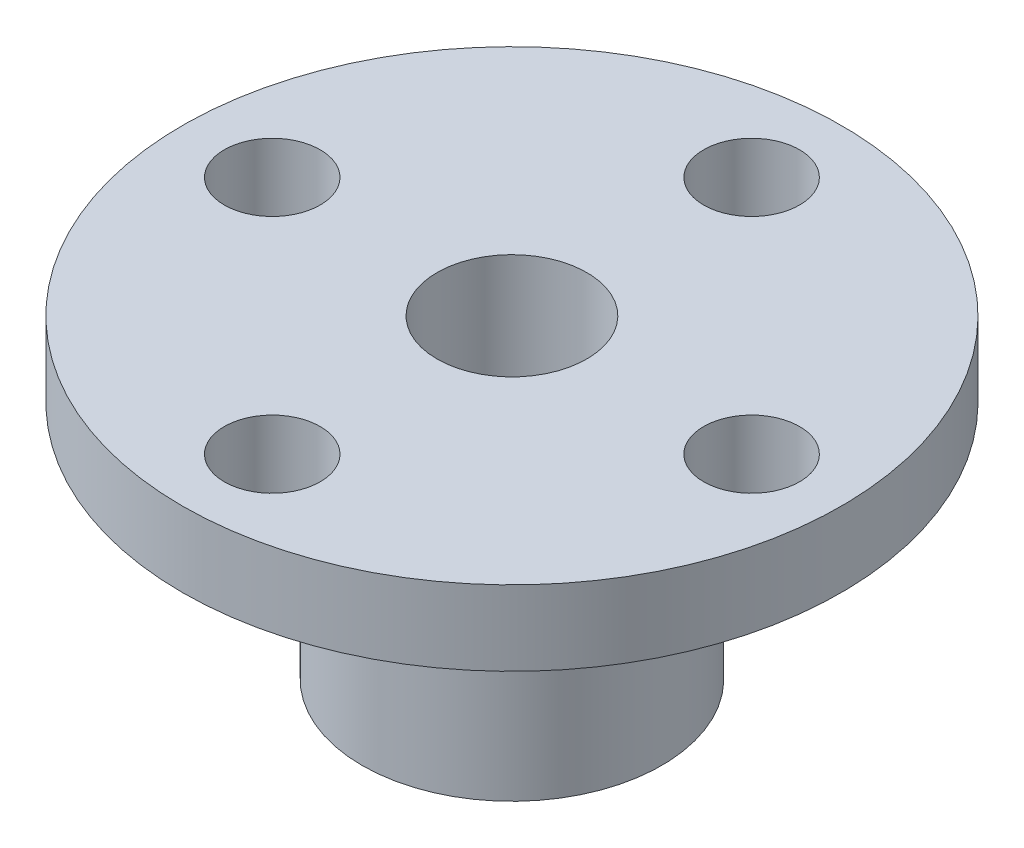
ISO-10303-21;
HEADER;
FILE_DESCRIPTION(('STEP AP214'),'2;1');
FILE_NAME('part.step','',(''),(''),'','','');
FILE_SCHEMA(('AUTOMOTIVE_DESIGN { 1 0 10303 214 1 1 1 1 }'));
ENDSEC;
DATA;
#1=APPLICATION_CONTEXT('core data for automotive mechanical design processes');
#2=APPLICATION_PROTOCOL_DEFINITION('international standard','automotive_design',2000,#1);
#3=PRODUCT_CONTEXT('',#1,'mechanical');
#4=PRODUCT('Part','Part','',(#3));
#5=PRODUCT_RELATED_PRODUCT_CATEGORY('part','',(#4));
#6=PRODUCT_DEFINITION_FORMATION('','',#4);
#7=PRODUCT_DEFINITION_CONTEXT('part definition',#1,'design');
#8=PRODUCT_DEFINITION('design','',#6,#7);
#9=PRODUCT_DEFINITION_SHAPE('','',#8);
#10=(LENGTH_UNIT() NAMED_UNIT(*) SI_UNIT(.MILLI.,.METRE.));
#11=(NAMED_UNIT(*) PLANE_ANGLE_UNIT() SI_UNIT($,.RADIAN.));
#12=(NAMED_UNIT(*) SI_UNIT($,.STERADIAN.) SOLID_ANGLE_UNIT());
#13=UNCERTAINTY_MEASURE_WITH_UNIT(LENGTH_MEASURE(1.E-05),#10,'distance_accuracy_value','');
#14=(GEOMETRIC_REPRESENTATION_CONTEXT(3) GLOBAL_UNCERTAINTY_ASSIGNED_CONTEXT((#13)) GLOBAL_UNIT_ASSIGNED_CONTEXT((#10,
#11,#12)) REPRESENTATION_CONTEXT('',''));
#15=CARTESIAN_POINT('',(0.,0.,0.));
#16=DIRECTION('',(0.,0.,1.));
#17=DIRECTION('',(1.,0.,0.));
#18=AXIS2_PLACEMENT_3D('',#15,#16,#17);
#19=CARTESIAN_POINT('',(0.,0.,0.));
#20=DIRECTION('',(0.,1.,0.));
#21=DIRECTION('',(0.,0.,1.));
#22=AXIS2_PLACEMENT_3D('',#19,#20,#21);
#23=PLANE('',#22);
#24=CARTESIAN_POINT('',(0.,0.,0.));
#25=DIRECTION('',(0.,1.,0.));
#26=DIRECTION('',(0.,0.,1.));
#27=AXIS2_PLACEMENT_3D('',#24,#25,#26);
#28=CIRCLE('',#27,5.);
#29=CARTESIAN_POINT('',(0.,0.,5.));
#30=VERTEX_POINT('',#29);
#31=EDGE_CURVE('E38',#30,#30,#28,.T.);
#32=ORIENTED_EDGE('',*,*,#31,.F.);
#33=EDGE_LOOP('',(#32));
#34=FACE_BOUND('',#33,.T.);
#35=CARTESIAN_POINT('',(0.,0.,0.));
#36=DIRECTION('',(0.,1.,0.));
#37=DIRECTION('',(0.,0.,1.));
#38=AXIS2_PLACEMENT_3D('',#35,#36,#37);
#39=CIRCLE('',#38,2.5);
#40=CARTESIAN_POINT('',(0.,0.,2.5));
#41=VERTEX_POINT('',#40);
#42=EDGE_CURVE('E45',#41,#41,#39,.T.);
#43=ORIENTED_EDGE('',*,*,#42,.T.);
#44=EDGE_LOOP('',(#43));
#45=FACE_BOUND('',#44,.T.);
#46=ADVANCED_FACE('F34',(#34,#45),#23,.F.);
#47=CARTESIAN_POINT('',(0.,8.,0.));
#48=DIRECTION('',(0.,-1.,0.));
#49=DIRECTION('',(0.,0.,-1.));
#50=AXIS2_PLACEMENT_3D('',#47,#48,#49);
#51=CYLINDRICAL_SURFACE('',#50,5.);
#52=CARTESIAN_POINT('',(0.,8.,0.));
#53=DIRECTION('',(0.,1.,0.));
#54=DIRECTION('',(0.,0.,1.));
#55=AXIS2_PLACEMENT_3D('',#52,#53,#54);
#56=CIRCLE('',#55,5.);
#57=CARTESIAN_POINT('',(0.,8.,5.));
#58=VERTEX_POINT('',#57);
#59=EDGE_CURVE('E10',#58,#58,#56,.T.);
#60=ORIENTED_EDGE('',*,*,#59,.F.);
#61=EDGE_LOOP('',(#60));
#62=FACE_BOUND('',#61,.T.);
#63=ORIENTED_EDGE('',*,*,#31,.T.);
#64=EDGE_LOOP('',(#63));
#65=FACE_BOUND('',#64,.T.);
#66=ADVANCED_FACE('F36',(#62,#65),#51,.T.);
#67=CARTESIAN_POINT('',(0.,8.,0.));
#68=DIRECTION('',(0.,-1.,0.));
#69=DIRECTION('',(0.,0.,-1.));
#70=AXIS2_PLACEMENT_3D('',#67,#68,#69);
#71=CYLINDRICAL_SURFACE('',#70,2.5);
#72=ORIENTED_EDGE('',*,*,#42,.F.);
#73=EDGE_LOOP('',(#72));
#74=FACE_BOUND('',#73,.T.);
#75=CARTESIAN_POINT('',(0.,10.5,0.));
#76=DIRECTION('',(0.,1.,0.));
#77=DIRECTION('',(0.,0.,1.));
#78=AXIS2_PLACEMENT_3D('',#75,#76,#77);
#79=CIRCLE('',#78,2.5);
#80=CARTESIAN_POINT('',(0.,10.5,2.5));
#81=VERTEX_POINT('',#80);
#82=EDGE_CURVE('E53',#81,#81,#79,.T.);
#83=ORIENTED_EDGE('',*,*,#82,.T.);
#84=EDGE_LOOP('',(#83));
#85=FACE_BOUND('',#84,.T.);
#86=ADVANCED_FACE('F89',(#74,#85),#71,.F.);
#87=CARTESIAN_POINT('',(0.,10.5,0.));
#88=DIRECTION('',(0.,1.,0.));
#89=DIRECTION('',(0.,0.,1.));
#90=AXIS2_PLACEMENT_3D('',#87,#88,#89);
#91=PLANE('',#90);
#92=CARTESIAN_POINT('',(-8.,10.5,0.));
#93=DIRECTION('',(0.,1.,0.));
#94=DIRECTION('',(0.,0.,1.));
#95=AXIS2_PLACEMENT_3D('',#92,#93,#94);
#96=CIRCLE('',#95,1.6);
#97=CARTESIAN_POINT('',(-8.,10.5,1.59999999999994));
#98=VERTEX_POINT('',#97);
#99=EDGE_CURVE('E68',#98,#98,#96,.T.);
#100=ORIENTED_EDGE('',*,*,#99,.F.);
#101=EDGE_LOOP('',(#100));
#102=FACE_BOUND('',#101,.T.);
#103=CARTESIAN_POINT('',(8.,10.5,0.));
#104=DIRECTION('',(0.,1.,0.));
#105=DIRECTION('',(0.,0.,1.));
#106=AXIS2_PLACEMENT_3D('',#103,#104,#105);
#107=CIRCLE('',#106,1.6);
#108=CARTESIAN_POINT('',(8.,10.5,1.6));
#109=VERTEX_POINT('',#108);
#110=EDGE_CURVE('E58',#109,#109,#107,.T.);
#111=ORIENTED_EDGE('',*,*,#110,.F.);
#112=EDGE_LOOP('',(#111));
#113=FACE_BOUND('',#112,.T.);
#114=CARTESIAN_POINT('',(0.,10.5,0.));
#115=DIRECTION('',(0.,1.,0.));
#116=DIRECTION('',(0.,0.,1.));
#117=AXIS2_PLACEMENT_3D('',#114,#115,#116);
#118=CIRCLE('',#117,11.);
#119=CARTESIAN_POINT('',(0.,10.5,11.));
#120=VERTEX_POINT('',#119);
#121=EDGE_CURVE('E49',#120,#120,#118,.T.);
#122=ORIENTED_EDGE('',*,*,#121,.T.);
#123=EDGE_LOOP('',(#122));
#124=FACE_BOUND('',#123,.T.);
#125=ORIENTED_EDGE('',*,*,#82,.F.);
#126=EDGE_LOOP('',(#125));
#127=FACE_BOUND('',#126,.T.);
#128=CARTESIAN_POINT('',(0.,10.5,8.));
#129=DIRECTION('',(0.,1.,0.));
#130=DIRECTION('',(0.,0.,1.));
#131=AXIS2_PLACEMENT_3D('',#128,#129,#130);
#132=CIRCLE('',#131,1.6);
#133=CARTESIAN_POINT('',(0.,10.5,9.6));
#134=VERTEX_POINT('',#133);
#135=EDGE_CURVE('E62',#134,#134,#132,.T.);
#136=ORIENTED_EDGE('',*,*,#135,.F.);
#137=EDGE_LOOP('',(#136));
#138=FACE_BOUND('',#137,.T.);
#139=CARTESIAN_POINT('',(0.,10.5,-8.));
#140=DIRECTION('',(0.,1.,0.));
#141=DIRECTION('',(0.,0.,1.));
#142=AXIS2_PLACEMENT_3D('',#139,#140,#141);
#143=CIRCLE('',#142,1.6);
#144=CARTESIAN_POINT('',(0.,10.5,-6.4));
#145=VERTEX_POINT('',#144);
#146=EDGE_CURVE('E74',#145,#145,#143,.T.);
#147=ORIENTED_EDGE('',*,*,#146,.F.);
#148=EDGE_LOOP('',(#147));
#149=FACE_BOUND('',#148,.T.);
#150=ADVANCED_FACE('F86',(#102,#113,#124,#127,#138,#149),#91,.T.);
#151=CARTESIAN_POINT('',(0.,8.,0.));
#152=DIRECTION('',(0.,1.,0.));
#153=DIRECTION('',(0.,0.,1.));
#154=AXIS2_PLACEMENT_3D('',#151,#152,#153);
#155=PLANE('',#154);
#156=ORIENTED_EDGE('',*,*,#59,.T.);
#157=EDGE_LOOP('',(#156));
#158=FACE_BOUND('',#157,.T.);
#159=CARTESIAN_POINT('',(0.,8.,0.));
#160=DIRECTION('',(0.,1.,0.));
#161=DIRECTION('',(0.,0.,1.));
#162=AXIS2_PLACEMENT_3D('',#159,#160,#161);
#163=CIRCLE('',#162,11.);
#164=CARTESIAN_POINT('',(0.,8.,11.));
#165=VERTEX_POINT('',#164);
#166=EDGE_CURVE('E50',#165,#165,#163,.T.);
#167=ORIENTED_EDGE('',*,*,#166,.F.);
#168=EDGE_LOOP('',(#167));
#169=FACE_BOUND('',#168,.T.);
#170=CARTESIAN_POINT('',(8.,8.,0.));
#171=DIRECTION('',(0.,1.,0.));
#172=DIRECTION('',(0.,0.,1.));
#173=AXIS2_PLACEMENT_3D('',#170,#171,#172);
#174=CIRCLE('',#173,1.6);
#175=CARTESIAN_POINT('',(8.,8.,1.6));
#176=VERTEX_POINT('',#175);
#177=EDGE_CURVE('E59',#176,#176,#174,.T.);
#178=ORIENTED_EDGE('',*,*,#177,.T.);
#179=EDGE_LOOP('',(#178));
#180=FACE_BOUND('',#179,.T.);
#181=CARTESIAN_POINT('',(0.,8.,8.));
#182=DIRECTION('',(0.,1.,0.));
#183=DIRECTION('',(0.,0.,1.));
#184=AXIS2_PLACEMENT_3D('',#181,#182,#183);
#185=CIRCLE('',#184,1.6);
#186=CARTESIAN_POINT('',(0.,8.,9.6));
#187=VERTEX_POINT('',#186);
#188=EDGE_CURVE('E65',#187,#187,#185,.T.);
#189=ORIENTED_EDGE('',*,*,#188,.T.);
#190=EDGE_LOOP('',(#189));
#191=FACE_BOUND('',#190,.T.);
#192=CARTESIAN_POINT('',(-8.,8.,0.));
#193=DIRECTION('',(0.,1.,0.));
#194=DIRECTION('',(0.,0.,1.));
#195=AXIS2_PLACEMENT_3D('',#192,#193,#194);
#196=CIRCLE('',#195,1.6);
#197=CARTESIAN_POINT('',(-8.,8.,1.59999999999994));
#198=VERTEX_POINT('',#197);
#199=EDGE_CURVE('E71',#198,#198,#196,.T.);
#200=ORIENTED_EDGE('',*,*,#199,.T.);
#201=EDGE_LOOP('',(#200));
#202=FACE_BOUND('',#201,.T.);
#203=CARTESIAN_POINT('',(0.,8.,-8.));
#204=DIRECTION('',(0.,1.,0.));
#205=DIRECTION('',(0.,0.,1.));
#206=AXIS2_PLACEMENT_3D('',#203,#204,#205);
#207=CIRCLE('',#206,1.6);
#208=CARTESIAN_POINT('',(0.,8.,-6.4));
#209=VERTEX_POINT('',#208);
#210=EDGE_CURVE('E77',#209,#209,#207,.T.);
#211=ORIENTED_EDGE('',*,*,#210,.T.);
#212=EDGE_LOOP('',(#211));
#213=FACE_BOUND('',#212,.T.);
#214=ADVANCED_FACE('F88',(#158,#169,#180,#191,#202,#213),#155,.F.);
#215=CARTESIAN_POINT('',(0.,10.5,0.));
#216=DIRECTION('',(0.,-1.,0.));
#217=DIRECTION('',(0.,0.,-1.));
#218=AXIS2_PLACEMENT_3D('',#215,#216,#217);
#219=CYLINDRICAL_SURFACE('',#218,11.);
#220=ORIENTED_EDGE('',*,*,#121,.F.);
#221=EDGE_LOOP('',(#220));
#222=FACE_BOUND('',#221,.T.);
#223=ORIENTED_EDGE('',*,*,#166,.T.);
#224=EDGE_LOOP('',(#223));
#225=FACE_BOUND('',#224,.T.);
#226=ADVANCED_FACE('F96',(#222,#225),#219,.T.);
#227=CARTESIAN_POINT('',(8.,10.5,0.));
#228=DIRECTION('',(0.,-1.,0.));
#229=DIRECTION('',(0.,0.,-1.));
#230=AXIS2_PLACEMENT_3D('',#227,#228,#229);
#231=CYLINDRICAL_SURFACE('',#230,1.6);
#232=ORIENTED_EDGE('',*,*,#110,.T.);
#233=EDGE_LOOP('',(#232));
#234=FACE_BOUND('',#233,.T.);
#235=ORIENTED_EDGE('',*,*,#177,.F.);
#236=EDGE_LOOP('',(#235));
#237=FACE_BOUND('',#236,.T.);
#238=ADVANCED_FACE('F113',(#234,#237),#231,.F.);
#239=CARTESIAN_POINT('',(0.,10.5,8.));
#240=DIRECTION('',(0.,-1.,0.));
#241=DIRECTION('',(0.,0.,-1.));
#242=AXIS2_PLACEMENT_3D('',#239,#240,#241);
#243=CYLINDRICAL_SURFACE('',#242,1.6);
#244=ORIENTED_EDGE('',*,*,#135,.T.);
#245=EDGE_LOOP('',(#244));
#246=FACE_BOUND('',#245,.T.);
#247=ORIENTED_EDGE('',*,*,#188,.F.);
#248=EDGE_LOOP('',(#247));
#249=FACE_BOUND('',#248,.T.);
#250=ADVANCED_FACE('F118',(#246,#249),#243,.F.);
#251=CARTESIAN_POINT('',(-8.,10.5,0.));
#252=DIRECTION('',(0.,-1.,0.));
#253=DIRECTION('',(0.,0.,-1.));
#254=AXIS2_PLACEMENT_3D('',#251,#252,#253);
#255=CYLINDRICAL_SURFACE('',#254,1.6);
#256=ORIENTED_EDGE('',*,*,#99,.T.);
#257=EDGE_LOOP('',(#256));
#258=FACE_BOUND('',#257,.T.);
#259=ORIENTED_EDGE('',*,*,#199,.F.);
#260=EDGE_LOOP('',(#259));
#261=FACE_BOUND('',#260,.T.);
#262=ADVANCED_FACE('F133',(#258,#261),#255,.F.);
#263=CARTESIAN_POINT('',(0.,10.5,-8.));
#264=DIRECTION('',(0.,-1.,0.));
#265=DIRECTION('',(0.,0.,-1.));
#266=AXIS2_PLACEMENT_3D('',#263,#264,#265);
#267=CYLINDRICAL_SURFACE('',#266,1.6);
#268=ORIENTED_EDGE('',*,*,#146,.T.);
#269=EDGE_LOOP('',(#268));
#270=FACE_BOUND('',#269,.T.);
#271=ORIENTED_EDGE('',*,*,#210,.F.);
#272=EDGE_LOOP('',(#271));
#273=FACE_BOUND('',#272,.T.);
#274=ADVANCED_FACE('F83',(#270,#273),#267,.F.);
#275=CLOSED_SHELL('',(#46,#66,#86,#150,#214,#226,#238,#250,#262,#274));
#276=MANIFOLD_SOLID_BREP('B2',#275);
#277=ADVANCED_BREP_SHAPE_REPRESENTATION('',(#18,#276),#14);
#278=SHAPE_DEFINITION_REPRESENTATION(#9,#277);
ENDSEC;
END-ISO-10303-21;
